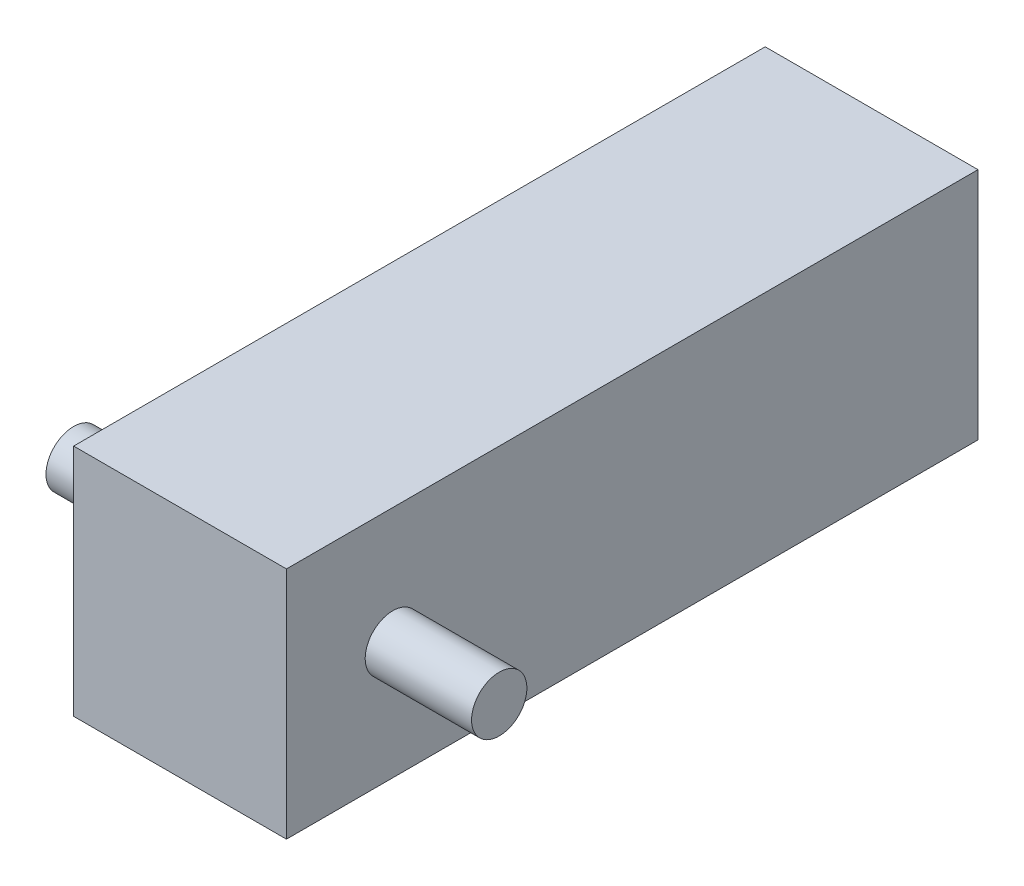
ISO-10303-21;
HEADER;
FILE_DESCRIPTION(('STEP AP214'),'2;1');
FILE_NAME('part.step','',(''),(''),'','','');
FILE_SCHEMA(('AUTOMOTIVE_DESIGN { 1 0 10303 214 1 1 1 1 }'));
ENDSEC;
DATA;
#1=APPLICATION_CONTEXT('core data for automotive mechanical design processes');
#2=APPLICATION_PROTOCOL_DEFINITION('international standard','automotive_design',2000,#1);
#3=PRODUCT_CONTEXT('',#1,'mechanical');
#4=PRODUCT('Part','Part','',(#3));
#5=PRODUCT_RELATED_PRODUCT_CATEGORY('part','',(#4));
#6=PRODUCT_DEFINITION_FORMATION('','',#4);
#7=PRODUCT_DEFINITION_CONTEXT('part definition',#1,'design');
#8=PRODUCT_DEFINITION('design','',#6,#7);
#9=PRODUCT_DEFINITION_SHAPE('','',#8);
#10=(LENGTH_UNIT() NAMED_UNIT(*) SI_UNIT(.MILLI.,.METRE.));
#11=(NAMED_UNIT(*) PLANE_ANGLE_UNIT() SI_UNIT($,.RADIAN.));
#12=(NAMED_UNIT(*) SI_UNIT($,.STERADIAN.) SOLID_ANGLE_UNIT());
#13=UNCERTAINTY_MEASURE_WITH_UNIT(LENGTH_MEASURE(1.E-05),#10,'distance_accuracy_value','');
#14=(GEOMETRIC_REPRESENTATION_CONTEXT(3) GLOBAL_UNCERTAINTY_ASSIGNED_CONTEXT((#13)) GLOBAL_UNIT_ASSIGNED_CONTEXT((#10,
#11,#12)) REPRESENTATION_CONTEXT('',''));
#15=CARTESIAN_POINT('',(0.,0.,0.));
#16=DIRECTION('',(0.,0.,1.));
#17=DIRECTION('',(1.,0.,0.));
#18=AXIS2_PLACEMENT_3D('',#15,#16,#17);
#19=CARTESIAN_POINT('',(10.,11.,32.5));
#20=DIRECTION('',(-1.,0.,0.));
#21=DIRECTION('',(0.,0.,1.));
#22=AXIS2_PLACEMENT_3D('',#19,#20,#21);
#23=PLANE('',#22);
#24=CARTESIAN_POINT('',(10.,0.,22.5));
#25=DIRECTION('',(-1.,0.,0.));
#26=DIRECTION('',(0.,0.,1.));
#27=AXIS2_PLACEMENT_3D('',#24,#25,#26);
#28=CIRCLE('',#27,2.6);
#29=CARTESIAN_POINT('',(10.,0.,25.1));
#30=VERTEX_POINT('',#29);
#31=EDGE_CURVE('E11',#30,#30,#28,.F.);
#32=ORIENTED_EDGE('',*,*,#31,.F.);
#33=EDGE_LOOP('',(#32));
#34=FACE_BOUND('',#33,.T.);
#35=DIRECTION('',(0.,0.,-1.));
#36=VECTOR('',#35,1.);
#37=CARTESIAN_POINT('',(10.,-11.,32.5));
#38=LINE('',#37,#36);
#39=CARTESIAN_POINT('',(10.,-11.,32.5));
#40=VERTEX_POINT('',#39);
#41=CARTESIAN_POINT('',(10.,-11.,-32.5));
#42=VERTEX_POINT('',#41);
#43=EDGE_CURVE('E112',#40,#42,#38,.T.);
#44=ORIENTED_EDGE('',*,*,#43,.T.);
#45=DIRECTION('',(0.,-1.,0.));
#46=VECTOR('',#45,1.);
#47=CARTESIAN_POINT('',(10.,11.,-32.5));
#48=LINE('',#47,#46);
#49=CARTESIAN_POINT('',(10.,11.,-32.5));
#50=VERTEX_POINT('',#49);
#51=EDGE_CURVE('E101',#50,#42,#48,.T.);
#52=ORIENTED_EDGE('',*,*,#51,.F.);
#53=DIRECTION('',(0.,0.,-1.));
#54=VECTOR('',#53,1.);
#55=CARTESIAN_POINT('',(10.,11.,32.5));
#56=LINE('',#55,#54);
#57=CARTESIAN_POINT('',(10.,11.,32.5));
#58=VERTEX_POINT('',#57);
#59=EDGE_CURVE('E93',#58,#50,#56,.T.);
#60=ORIENTED_EDGE('',*,*,#59,.F.);
#61=DIRECTION('',(0.,-1.,0.));
#62=VECTOR('',#61,1.);
#63=CARTESIAN_POINT('',(10.,11.,32.5));
#64=LINE('',#63,#62);
#65=EDGE_CURVE('E108',#58,#40,#64,.T.);
#66=ORIENTED_EDGE('',*,*,#65,.T.);
#67=EDGE_LOOP('',(#44,#52,#60,#66));
#68=FACE_BOUND('',#67,.T.);
#69=ADVANCED_FACE('F39',(#34,#68),#23,.F.);
#70=CARTESIAN_POINT('',(-10.,11.,-32.5));
#71=DIRECTION('',(0.,0.,1.));
#72=DIRECTION('',(1.,0.,0.));
#73=AXIS2_PLACEMENT_3D('',#70,#71,#72);
#74=PLANE('',#73);
#75=DIRECTION('',(-1.,0.,0.));
#76=VECTOR('',#75,1.);
#77=CARTESIAN_POINT('',(-10.,-11.,-32.5));
#78=LINE('',#77,#76);
#79=CARTESIAN_POINT('',(-10.,-11.,-32.5));
#80=VERTEX_POINT('',#79);
#81=EDGE_CURVE('E99',#42,#80,#78,.T.);
#82=ORIENTED_EDGE('',*,*,#81,.T.);
#83=DIRECTION('',(0.,-1.,0.));
#84=VECTOR('',#83,1.);
#85=CARTESIAN_POINT('',(-10.,11.,-32.5));
#86=LINE('',#85,#84);
#87=CARTESIAN_POINT('',(-10.,11.,-32.5));
#88=VERTEX_POINT('',#87);
#89=EDGE_CURVE('E97',#88,#80,#86,.T.);
#90=ORIENTED_EDGE('',*,*,#89,.F.);
#91=DIRECTION('',(-1.,0.,0.));
#92=VECTOR('',#91,1.);
#93=CARTESIAN_POINT('',(-10.,11.,-32.5));
#94=LINE('',#93,#92);
#95=EDGE_CURVE('E88',#50,#88,#94,.T.);
#96=ORIENTED_EDGE('',*,*,#95,.F.);
#97=ORIENTED_EDGE('',*,*,#51,.T.);
#98=EDGE_LOOP('',(#82,#90,#96,#97));
#99=FACE_BOUND('',#98,.T.);
#100=ADVANCED_FACE('F98',(#99),#74,.F.);
#101=CARTESIAN_POINT('',(-10.,11.,32.5));
#102=DIRECTION('',(1.,0.,0.));
#103=DIRECTION('',(0.,0.,-1.));
#104=AXIS2_PLACEMENT_3D('',#101,#102,#103);
#105=PLANE('',#104);
#106=CARTESIAN_POINT('',(-10.,0.,22.5));
#107=DIRECTION('',(1.,0.,0.));
#108=DIRECTION('',(0.,0.,-1.));
#109=AXIS2_PLACEMENT_3D('',#106,#107,#108);
#110=CIRCLE('',#109,2.6);
#111=CARTESIAN_POINT('',(-10.,0.,19.9));
#112=VERTEX_POINT('',#111);
#113=EDGE_CURVE('E42',#112,#112,#110,.F.);
#114=ORIENTED_EDGE('',*,*,#113,.F.);
#115=EDGE_LOOP('',(#114));
#116=FACE_BOUND('',#115,.T.);
#117=DIRECTION('',(0.,0.,1.));
#118=VECTOR('',#117,1.);
#119=CARTESIAN_POINT('',(-10.,-11.,32.5));
#120=LINE('',#119,#118);
#121=CARTESIAN_POINT('',(-10.,-11.,32.5));
#122=VERTEX_POINT('',#121);
#123=EDGE_CURVE('E74',#80,#122,#120,.T.);
#124=ORIENTED_EDGE('',*,*,#123,.T.);
#125=DIRECTION('',(0.,-1.,0.));
#126=VECTOR('',#125,1.);
#127=CARTESIAN_POINT('',(-10.,11.,32.5));
#128=LINE('',#127,#126);
#129=CARTESIAN_POINT('',(-10.,11.,32.5));
#130=VERTEX_POINT('',#129);
#131=EDGE_CURVE('E102',#130,#122,#128,.T.);
#132=ORIENTED_EDGE('',*,*,#131,.F.);
#133=DIRECTION('',(0.,0.,1.));
#134=VECTOR('',#133,1.);
#135=CARTESIAN_POINT('',(-10.,11.,32.5));
#136=LINE('',#135,#134);
#137=EDGE_CURVE('E91',#88,#130,#136,.T.);
#138=ORIENTED_EDGE('',*,*,#137,.F.);
#139=ORIENTED_EDGE('',*,*,#89,.T.);
#140=EDGE_LOOP('',(#124,#132,#138,#139));
#141=FACE_BOUND('',#140,.T.);
#142=ADVANCED_FACE('F104',(#116,#141),#105,.F.);
#143=CARTESIAN_POINT('',(-10.,11.,32.5));
#144=DIRECTION('',(0.,0.,-1.));
#145=DIRECTION('',(-1.,0.,0.));
#146=AXIS2_PLACEMENT_3D('',#143,#144,#145);
#147=PLANE('',#146);
#148=DIRECTION('',(1.,0.,0.));
#149=VECTOR('',#148,1.);
#150=CARTESIAN_POINT('',(-10.,-11.,32.5));
#151=LINE('',#150,#149);
#152=EDGE_CURVE('E80',#122,#40,#151,.T.);
#153=ORIENTED_EDGE('',*,*,#152,.T.);
#154=ORIENTED_EDGE('',*,*,#65,.F.);
#155=DIRECTION('',(1.,0.,0.));
#156=VECTOR('',#155,1.);
#157=CARTESIAN_POINT('',(-10.,11.,32.5));
#158=LINE('',#157,#156);
#159=EDGE_CURVE('E57',#130,#58,#158,.T.);
#160=ORIENTED_EDGE('',*,*,#159,.F.);
#161=ORIENTED_EDGE('',*,*,#131,.T.);
#162=EDGE_LOOP('',(#153,#154,#160,#161));
#163=FACE_BOUND('',#162,.T.);
#164=ADVANCED_FACE('F134',(#163),#147,.F.);
#165=CARTESIAN_POINT('',(0.,11.,0.));
#166=DIRECTION('',(0.,-1.,0.));
#167=DIRECTION('',(0.,0.,-1.));
#168=AXIS2_PLACEMENT_3D('',#165,#166,#167);
#169=PLANE('',#168);
#170=ORIENTED_EDGE('',*,*,#59,.T.);
#171=ORIENTED_EDGE('',*,*,#95,.T.);
#172=ORIENTED_EDGE('',*,*,#137,.T.);
#173=ORIENTED_EDGE('',*,*,#159,.T.);
#174=EDGE_LOOP('',(#170,#171,#172,#173));
#175=FACE_BOUND('',#174,.T.);
#176=ADVANCED_FACE('F89',(#175),#169,.F.);
#177=CARTESIAN_POINT('',(0.,-11.,0.));
#178=DIRECTION('',(0.,-1.,0.));
#179=DIRECTION('',(0.,0.,-1.));
#180=AXIS2_PLACEMENT_3D('',#177,#178,#179);
#181=PLANE('',#180);
#182=ORIENTED_EDGE('',*,*,#43,.F.);
#183=ORIENTED_EDGE('',*,*,#152,.F.);
#184=ORIENTED_EDGE('',*,*,#123,.F.);
#185=ORIENTED_EDGE('',*,*,#81,.F.);
#186=EDGE_LOOP('',(#182,#183,#184,#185));
#187=FACE_BOUND('',#186,.T.);
#188=ADVANCED_FACE('F149',(#187),#181,.T.);
#189=CARTESIAN_POINT('',(-20.,0.,22.5));
#190=DIRECTION('',(-1.,0.,0.));
#191=DIRECTION('',(0.,0.,1.));
#192=AXIS2_PLACEMENT_3D('',#189,#190,#191);
#193=PLANE('',#192);
#194=CARTESIAN_POINT('',(-20.,0.,22.5));
#195=DIRECTION('',(-1.,0.,0.));
#196=DIRECTION('',(0.,0.,1.));
#197=AXIS2_PLACEMENT_3D('',#194,#195,#196);
#198=CIRCLE('',#197,2.6);
#199=CARTESIAN_POINT('',(-20.,0.,25.1));
#200=VERTEX_POINT('',#199);
#201=EDGE_CURVE('E116',#200,#200,#198,.T.);
#202=ORIENTED_EDGE('',*,*,#201,.T.);
#203=EDGE_LOOP('',(#202));
#204=FACE_BOUND('',#203,.T.);
#205=ADVANCED_FACE('F151',(#204),#193,.T.);
#206=CARTESIAN_POINT('',(-20.,0.,22.5));
#207=DIRECTION('',(1.,0.,0.));
#208=DIRECTION('',(0.,0.,-1.));
#209=AXIS2_PLACEMENT_3D('',#206,#207,#208);
#210=CYLINDRICAL_SURFACE('',#209,2.6);
#211=ORIENTED_EDGE('',*,*,#201,.F.);
#212=EDGE_LOOP('',(#211));
#213=FACE_BOUND('',#212,.T.);
#214=ORIENTED_EDGE('',*,*,#113,.T.);
#215=EDGE_LOOP('',(#214));
#216=FACE_BOUND('',#215,.T.);
#217=ADVANCED_FACE('F131',(#213,#216),#210,.T.);
#218=CARTESIAN_POINT('',(20.,0.,22.5));
#219=DIRECTION('',(-1.,0.,0.));
#220=DIRECTION('',(0.,0.,1.));
#221=AXIS2_PLACEMENT_3D('',#218,#219,#220);
#222=CIRCLE('',#221,2.6);
#223=CARTESIAN_POINT('',(20.,0.,25.1));
#224=VERTEX_POINT('',#223);
#225=EDGE_CURVE('E172',#224,#224,#222,.T.);
#226=ORIENTED_EDGE('',*,*,#225,.T.);
#227=EDGE_LOOP('',(#226));
#228=FACE_BOUND('',#227,.T.);
#229=ORIENTED_EDGE('',*,*,#31,.T.);
#230=EDGE_LOOP('',(#229));
#231=FACE_BOUND('',#230,.T.);
#232=ADVANCED_FACE('F161',(#228,#231),#210,.T.);
#233=CARTESIAN_POINT('',(20.,0.,22.5));
#234=DIRECTION('',(-1.,0.,0.));
#235=DIRECTION('',(0.,0.,1.));
#236=AXIS2_PLACEMENT_3D('',#233,#234,#235);
#237=PLANE('',#236);
#238=ORIENTED_EDGE('',*,*,#225,.F.);
#239=EDGE_LOOP('',(#238));
#240=FACE_BOUND('',#239,.T.);
#241=ADVANCED_FACE('F164',(#240),#237,.F.);
#242=CLOSED_SHELL('',(#69,#100,#142,#164,#176,#188,#205,#217,#232,#241));
#243=MANIFOLD_SOLID_BREP('B2',#242);
#244=ADVANCED_BREP_SHAPE_REPRESENTATION('',(#18,#243),#14);
#245=SHAPE_DEFINITION_REPRESENTATION(#9,#244);
ENDSEC;
END-ISO-10303-21;
